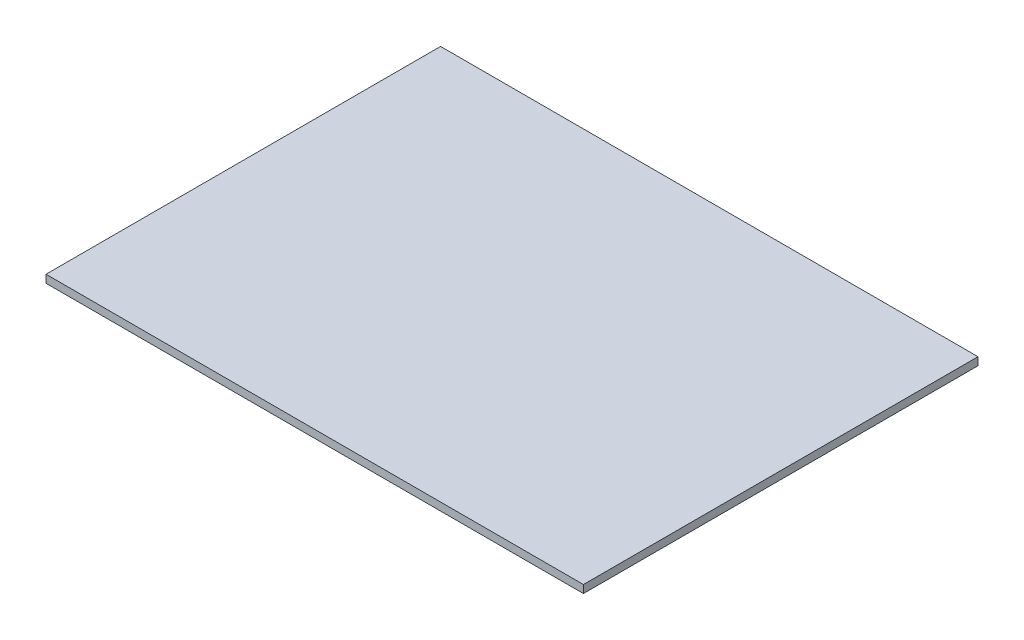
ISO-10303-21;
HEADER;
FILE_DESCRIPTION(('STEP AP214'),'2;1');
FILE_NAME('part.step','',(''),(''),'','','');
FILE_SCHEMA(('AUTOMOTIVE_DESIGN { 1 0 10303 214 1 1 1 1 }'));
ENDSEC;
DATA;
#1=APPLICATION_CONTEXT('core data for automotive mechanical design processes');
#2=APPLICATION_PROTOCOL_DEFINITION('international standard','automotive_design',2000,#1);
#3=PRODUCT_CONTEXT('',#1,'mechanical');
#4=PRODUCT('Part','Part','',(#3));
#5=PRODUCT_RELATED_PRODUCT_CATEGORY('part','',(#4));
#6=PRODUCT_DEFINITION_FORMATION('','',#4);
#7=PRODUCT_DEFINITION_CONTEXT('part definition',#1,'design');
#8=PRODUCT_DEFINITION('design','',#6,#7);
#9=PRODUCT_DEFINITION_SHAPE('','',#8);
#10=(LENGTH_UNIT() NAMED_UNIT(*) SI_UNIT(.MILLI.,.METRE.));
#11=(NAMED_UNIT(*) PLANE_ANGLE_UNIT() SI_UNIT($,.RADIAN.));
#12=(NAMED_UNIT(*) SI_UNIT($,.STERADIAN.) SOLID_ANGLE_UNIT());
#13=UNCERTAINTY_MEASURE_WITH_UNIT(LENGTH_MEASURE(1.E-05),#10,'distance_accuracy_value','');
#14=(GEOMETRIC_REPRESENTATION_CONTEXT(3) GLOBAL_UNCERTAINTY_ASSIGNED_CONTEXT((#13)) GLOBAL_UNIT_ASSIGNED_CONTEXT((#10,
#11,#12)) REPRESENTATION_CONTEXT('',''));
#15=CARTESIAN_POINT('',(0.,0.,0.));
#16=DIRECTION('',(0.,0.,1.));
#17=DIRECTION('',(1.,0.,0.));
#18=AXIS2_PLACEMENT_3D('',#15,#16,#17);
#19=CARTESIAN_POINT('',(0.,2.54,0.));
#20=DIRECTION('',(1.,0.,0.));
#21=DIRECTION('',(0.,0.,-1.));
#22=AXIS2_PLACEMENT_3D('',#19,#20,#21);
#23=PLANE('',#22);
#24=DIRECTION('',(0.,0.,1.));
#25=VECTOR('',#24,1.);
#26=CARTESIAN_POINT('',(0.,0.,0.));
#27=LINE('',#26,#25);
#28=CARTESIAN_POINT('',(-1.11022302462516E-13,0.,-127.6));
#29=VERTEX_POINT('',#28);
#30=CARTESIAN_POINT('',(0.,0.,0.));
#31=VERTEX_POINT('',#30);
#32=EDGE_CURVE('E97',#29,#31,#27,.T.);
#33=ORIENTED_EDGE('',*,*,#32,.T.);
#34=DIRECTION('',(0.,-1.,0.));
#35=VECTOR('',#34,1.);
#36=CARTESIAN_POINT('',(0.,2.54,0.));
#37=LINE('',#36,#35);
#38=CARTESIAN_POINT('',(0.,2.54,0.));
#39=VERTEX_POINT('',#38);
#40=EDGE_CURVE('E11',#39,#31,#37,.T.);
#41=ORIENTED_EDGE('',*,*,#40,.F.);
#42=DIRECTION('',(0.,0.,1.));
#43=VECTOR('',#42,1.);
#44=CARTESIAN_POINT('',(0.,2.54,0.));
#45=LINE('',#44,#43);
#46=CARTESIAN_POINT('',(-1.11022302462516E-13,2.54,-127.6));
#47=VERTEX_POINT('',#46);
#48=EDGE_CURVE('E85',#47,#39,#45,.T.);
#49=ORIENTED_EDGE('',*,*,#48,.F.);
#50=DIRECTION('',(0.,-1.,0.));
#51=VECTOR('',#50,1.);
#52=CARTESIAN_POINT('',(-1.11022302462516E-13,2.54,-127.6));
#53=LINE('',#52,#51);
#54=EDGE_CURVE('E93',#47,#29,#53,.T.);
#55=ORIENTED_EDGE('',*,*,#54,.T.);
#56=EDGE_LOOP('',(#33,#41,#49,#55));
#57=FACE_BOUND('',#56,.T.);
#58=ADVANCED_FACE('F34',(#57),#23,.F.);
#59=CARTESIAN_POINT('',(0.,2.54,0.));
#60=DIRECTION('',(0.,0.,-1.));
#61=DIRECTION('',(-1.,0.,0.));
#62=AXIS2_PLACEMENT_3D('',#59,#60,#61);
#63=PLANE('',#62);
#64=DIRECTION('',(1.,0.,0.));
#65=VECTOR('',#64,1.);
#66=CARTESIAN_POINT('',(0.,0.,0.));
#67=LINE('',#66,#65);
#68=CARTESIAN_POINT('',(173.8,0.,0.));
#69=VERTEX_POINT('',#68);
#70=EDGE_CURVE('E89',#31,#69,#67,.T.);
#71=ORIENTED_EDGE('',*,*,#70,.T.);
#72=DIRECTION('',(0.,-1.,0.));
#73=VECTOR('',#72,1.);
#74=CARTESIAN_POINT('',(173.8,2.54,0.));
#75=LINE('',#74,#73);
#76=CARTESIAN_POINT('',(173.8,2.54,0.));
#77=VERTEX_POINT('',#76);
#78=EDGE_CURVE('E42',#77,#69,#75,.T.);
#79=ORIENTED_EDGE('',*,*,#78,.F.);
#80=DIRECTION('',(1.,0.,0.));
#81=VECTOR('',#80,1.);
#82=CARTESIAN_POINT('',(0.,2.54,0.));
#83=LINE('',#82,#81);
#84=EDGE_CURVE('E80',#39,#77,#83,.T.);
#85=ORIENTED_EDGE('',*,*,#84,.F.);
#86=ORIENTED_EDGE('',*,*,#40,.T.);
#87=EDGE_LOOP('',(#71,#79,#85,#86));
#88=FACE_BOUND('',#87,.T.);
#89=ADVANCED_FACE('F88',(#88),#63,.F.);
#90=CARTESIAN_POINT('',(173.8,2.54,0.));
#91=DIRECTION('',(-1.,0.,0.));
#92=DIRECTION('',(0.,0.,1.));
#93=AXIS2_PLACEMENT_3D('',#90,#91,#92);
#94=PLANE('',#93);
#95=DIRECTION('',(0.,0.,-1.));
#96=VECTOR('',#95,1.);
#97=CARTESIAN_POINT('',(173.8,0.,0.));
#98=LINE('',#97,#96);
#99=CARTESIAN_POINT('',(173.8,0.,-127.6));
#100=VERTEX_POINT('',#99);
#101=EDGE_CURVE('E67',#69,#100,#98,.T.);
#102=ORIENTED_EDGE('',*,*,#101,.T.);
#103=DIRECTION('',(0.,-1.,0.));
#104=VECTOR('',#103,1.);
#105=CARTESIAN_POINT('',(173.8,2.54,-127.6));
#106=LINE('',#105,#104);
#107=CARTESIAN_POINT('',(173.8,2.54,-127.6));
#108=VERTEX_POINT('',#107);
#109=EDGE_CURVE('E90',#108,#100,#106,.T.);
#110=ORIENTED_EDGE('',*,*,#109,.F.);
#111=DIRECTION('',(0.,0.,-1.));
#112=VECTOR('',#111,1.);
#113=CARTESIAN_POINT('',(173.8,2.54,0.));
#114=LINE('',#113,#112);
#115=EDGE_CURVE('E83',#77,#108,#114,.T.);
#116=ORIENTED_EDGE('',*,*,#115,.F.);
#117=ORIENTED_EDGE('',*,*,#78,.T.);
#118=EDGE_LOOP('',(#102,#110,#116,#117));
#119=FACE_BOUND('',#118,.T.);
#120=ADVANCED_FACE('F91',(#119),#94,.F.);
#121=CARTESIAN_POINT('',(-1.11022302462516E-13,2.54,-127.6));
#122=DIRECTION('',(0.,0.,1.));
#123=DIRECTION('',(1.,0.,0.));
#124=AXIS2_PLACEMENT_3D('',#121,#122,#123);
#125=PLANE('',#124);
#126=DIRECTION('',(-1.,0.,0.));
#127=VECTOR('',#126,1.);
#128=CARTESIAN_POINT('',(-1.11022302462516E-13,0.,-127.6));
#129=LINE('',#128,#127);
#130=EDGE_CURVE('E73',#100,#29,#129,.T.);
#131=ORIENTED_EDGE('',*,*,#130,.T.);
#132=ORIENTED_EDGE('',*,*,#54,.F.);
#133=DIRECTION('',(-1.,0.,0.));
#134=VECTOR('',#133,1.);
#135=CARTESIAN_POINT('',(-1.11022302462516E-13,2.54,-127.6));
#136=LINE('',#135,#134);
#137=EDGE_CURVE('E50',#108,#47,#136,.T.);
#138=ORIENTED_EDGE('',*,*,#137,.F.);
#139=ORIENTED_EDGE('',*,*,#109,.T.);
#140=EDGE_LOOP('',(#131,#132,#138,#139));
#141=FACE_BOUND('',#140,.T.);
#142=ADVANCED_FACE('F104',(#141),#125,.F.);
#143=CARTESIAN_POINT('',(0.,2.54,0.));
#144=DIRECTION('',(0.,-1.,0.));
#145=DIRECTION('',(0.,0.,-1.));
#146=AXIS2_PLACEMENT_3D('',#143,#144,#145);
#147=PLANE('',#146);
#148=ORIENTED_EDGE('',*,*,#48,.T.);
#149=ORIENTED_EDGE('',*,*,#84,.T.);
#150=ORIENTED_EDGE('',*,*,#115,.T.);
#151=ORIENTED_EDGE('',*,*,#137,.T.);
#152=EDGE_LOOP('',(#148,#149,#150,#151));
#153=FACE_BOUND('',#152,.T.);
#154=ADVANCED_FACE('F81',(#153),#147,.F.);
#155=CARTESIAN_POINT('',(0.,0.,0.));
#156=DIRECTION('',(0.,-1.,0.));
#157=DIRECTION('',(0.,0.,-1.));
#158=AXIS2_PLACEMENT_3D('',#155,#156,#157);
#159=PLANE('',#158);
#160=ORIENTED_EDGE('',*,*,#32,.F.);
#161=ORIENTED_EDGE('',*,*,#130,.F.);
#162=ORIENTED_EDGE('',*,*,#101,.F.);
#163=ORIENTED_EDGE('',*,*,#70,.F.);
#164=EDGE_LOOP('',(#160,#161,#162,#163));
#165=FACE_BOUND('',#164,.T.);
#166=ADVANCED_FACE('F107',(#165),#159,.T.);
#167=CLOSED_SHELL('',(#58,#89,#120,#142,#154,#166));
#168=MANIFOLD_SOLID_BREP('B2',#167);
#169=ADVANCED_BREP_SHAPE_REPRESENTATION('',(#18,#168),#14);
#170=SHAPE_DEFINITION_REPRESENTATION(#9,#169);
ENDSEC;
END-ISO-10303-21;
